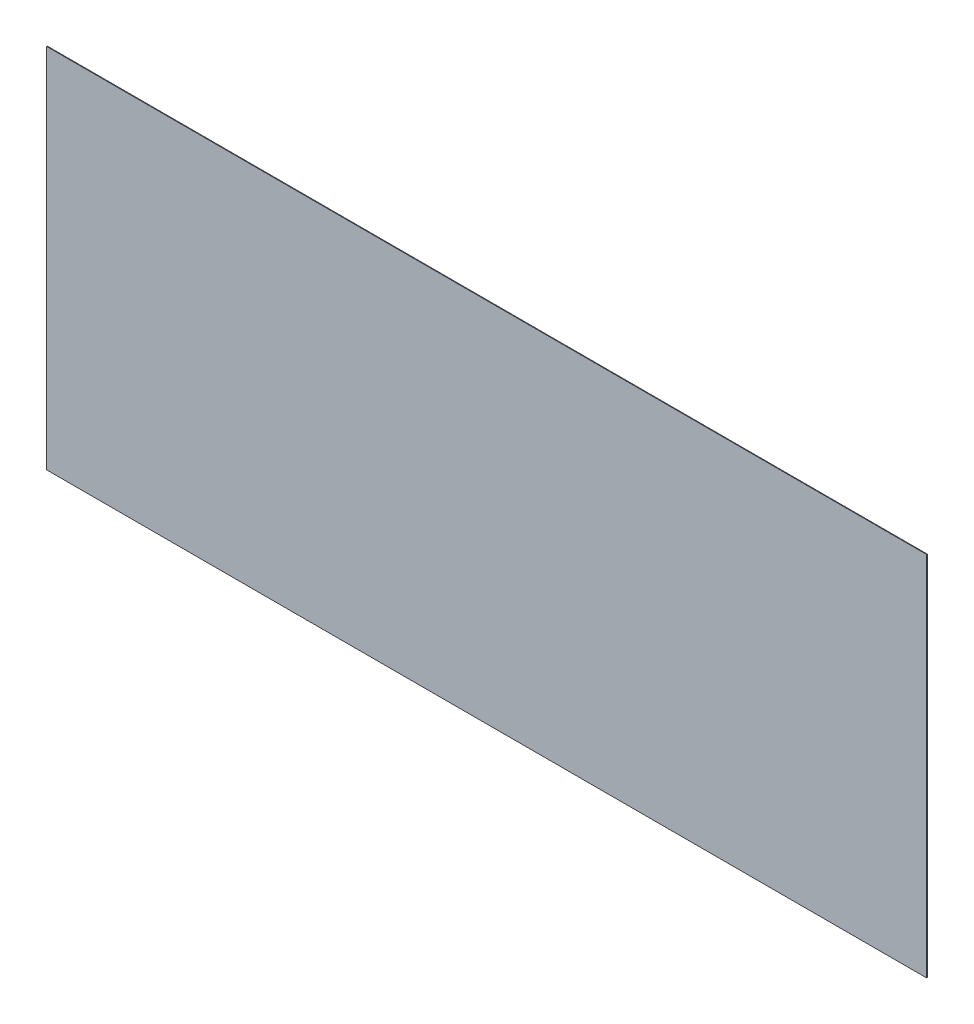
ISO-10303-21;
HEADER;
FILE_DESCRIPTION(('STEP AP214'),'2;1');
FILE_NAME('part.step','',(''),(''),'','','');
FILE_SCHEMA(('AUTOMOTIVE_DESIGN { 1 0 10303 214 1 1 1 1 }'));
ENDSEC;
DATA;
#1=APPLICATION_CONTEXT('core data for automotive mechanical design processes');
#2=APPLICATION_PROTOCOL_DEFINITION('international standard','automotive_design',2000,#1);
#3=PRODUCT_CONTEXT('',#1,'mechanical');
#4=PRODUCT('Part','Part','',(#3));
#5=PRODUCT_RELATED_PRODUCT_CATEGORY('part','',(#4));
#6=PRODUCT_DEFINITION_FORMATION('','',#4);
#7=PRODUCT_DEFINITION_CONTEXT('part definition',#1,'design');
#8=PRODUCT_DEFINITION('design','',#6,#7);
#9=PRODUCT_DEFINITION_SHAPE('','',#8);
#10=(LENGTH_UNIT() NAMED_UNIT(*) SI_UNIT(.MILLI.,.METRE.));
#11=(NAMED_UNIT(*) PLANE_ANGLE_UNIT() SI_UNIT($,.RADIAN.));
#12=(NAMED_UNIT(*) SI_UNIT($,.STERADIAN.) SOLID_ANGLE_UNIT());
#13=UNCERTAINTY_MEASURE_WITH_UNIT(LENGTH_MEASURE(1.E-05),#10,'distance_accuracy_value','');
#14=(GEOMETRIC_REPRESENTATION_CONTEXT(3) GLOBAL_UNCERTAINTY_ASSIGNED_CONTEXT((#13)) GLOBAL_UNIT_ASSIGNED_CONTEXT((#10,
#11,#12)) REPRESENTATION_CONTEXT('',''));
#15=CARTESIAN_POINT('',(0.,0.,0.));
#16=DIRECTION('',(0.,0.,1.));
#17=DIRECTION('',(1.,0.,0.));
#18=AXIS2_PLACEMENT_3D('',#15,#16,#17);
#19=CARTESIAN_POINT('',(-381.51349744069,331.380753138075,0.9));
#20=DIRECTION('',(1.,0.,0.));
#21=DIRECTION('',(0.,1.,0.));
#22=AXIS2_PLACEMENT_3D('',#19,#20,#21);
#23=PLANE('',#22);
#24=DIRECTION('',(0.,-1.,0.));
#25=VECTOR('',#24,1.);
#26=CARTESIAN_POINT('',(-381.51349744069,331.380753138075,0.));
#27=LINE('',#26,#25);
#28=CARTESIAN_POINT('',(-381.51349744069,331.380753138075,0.));
#29=VERTEX_POINT('',#28);
#30=CARTESIAN_POINT('',(-381.51349744069,-168.619246861924,0.));
#31=VERTEX_POINT('',#30);
#32=EDGE_CURVE('E113',#29,#31,#27,.T.);
#33=ORIENTED_EDGE('',*,*,#32,.T.);
#34=DIRECTION('',(0.,0.,-1.));
#35=VECTOR('',#34,1.);
#36=CARTESIAN_POINT('',(-381.51349744069,-168.619246861924,0.9));
#37=LINE('',#36,#35);
#38=CARTESIAN_POINT('',(-381.51349744069,-168.619246861924,0.9));
#39=VERTEX_POINT('',#38);
#40=EDGE_CURVE('E11',#39,#31,#37,.T.);
#41=ORIENTED_EDGE('',*,*,#40,.F.);
#42=DIRECTION('',(0.,-1.,0.));
#43=VECTOR('',#42,1.);
#44=CARTESIAN_POINT('',(-381.51349744069,331.380753138075,0.9));
#45=LINE('',#44,#43);
#46=CARTESIAN_POINT('',(-381.51349744069,331.380753138075,0.9));
#47=VERTEX_POINT('',#46);
#48=EDGE_CURVE('E97',#47,#39,#45,.T.);
#49=ORIENTED_EDGE('',*,*,#48,.F.);
#50=DIRECTION('',(0.,0.,-1.));
#51=VECTOR('',#50,1.);
#52=CARTESIAN_POINT('',(-381.51349744069,331.380753138075,0.9));
#53=LINE('',#52,#51);
#54=EDGE_CURVE('E109',#47,#29,#53,.T.);
#55=ORIENTED_EDGE('',*,*,#54,.T.);
#56=EDGE_LOOP('',(#33,#41,#49,#55));
#57=FACE_BOUND('',#56,.T.);
#58=ADVANCED_FACE('F45',(#57),#23,.F.);
#59=CARTESIAN_POINT('',(-381.51349744069,-168.619246861924,0.9));
#60=DIRECTION('',(0.,1.,0.));
#61=DIRECTION('',(0.,0.,1.));
#62=AXIS2_PLACEMENT_3D('',#59,#60,#61);
#63=PLANE('',#62);
#64=DIRECTION('',(1.,0.,0.));
#65=VECTOR('',#64,1.);
#66=CARTESIAN_POINT('',(-381.51349744069,-168.619246861924,0.));
#67=LINE('',#66,#65);
#68=CARTESIAN_POINT('',(818.48650255931,-168.619246861924,0.));
#69=VERTEX_POINT('',#68);
#70=EDGE_CURVE('E102',#31,#69,#67,.T.);
#71=ORIENTED_EDGE('',*,*,#70,.T.);
#72=DIRECTION('',(0.,0.,-1.));
#73=VECTOR('',#72,1.);
#74=CARTESIAN_POINT('',(818.48650255931,-168.619246861924,0.9));
#75=LINE('',#74,#73);
#76=CARTESIAN_POINT('',(818.48650255931,-168.619246861924,0.9));
#77=VERTEX_POINT('',#76);
#78=EDGE_CURVE('E54',#77,#69,#75,.T.);
#79=ORIENTED_EDGE('',*,*,#78,.F.);
#80=DIRECTION('',(1.,0.,0.));
#81=VECTOR('',#80,1.);
#82=CARTESIAN_POINT('',(-381.51349744069,-168.619246861924,0.9));
#83=LINE('',#82,#81);
#84=EDGE_CURVE('E92',#39,#77,#83,.T.);
#85=ORIENTED_EDGE('',*,*,#84,.F.);
#86=ORIENTED_EDGE('',*,*,#40,.T.);
#87=EDGE_LOOP('',(#71,#79,#85,#86));
#88=FACE_BOUND('',#87,.T.);
#89=ADVANCED_FACE('F101',(#88),#63,.F.);
#90=CARTESIAN_POINT('',(818.48650255931,331.380753138075,0.9));
#91=DIRECTION('',(-1.,0.,0.));
#92=DIRECTION('',(0.,-1.,0.));
#93=AXIS2_PLACEMENT_3D('',#90,#91,#92);
#94=PLANE('',#93);
#95=DIRECTION('',(0.,1.,0.));
#96=VECTOR('',#95,1.);
#97=CARTESIAN_POINT('',(818.48650255931,331.380753138075,0.));
#98=LINE('',#97,#96);
#99=CARTESIAN_POINT('',(818.48650255931,331.380753138075,0.));
#100=VERTEX_POINT('',#99);
#101=EDGE_CURVE('E79',#69,#100,#98,.T.);
#102=ORIENTED_EDGE('',*,*,#101,.T.);
#103=DIRECTION('',(0.,0.,-1.));
#104=VECTOR('',#103,1.);
#105=CARTESIAN_POINT('',(818.48650255931,331.380753138075,0.9));
#106=LINE('',#105,#104);
#107=CARTESIAN_POINT('',(818.48650255931,331.380753138075,0.9));
#108=VERTEX_POINT('',#107);
#109=EDGE_CURVE('E104',#108,#100,#106,.T.);
#110=ORIENTED_EDGE('',*,*,#109,.F.);
#111=DIRECTION('',(0.,1.,0.));
#112=VECTOR('',#111,1.);
#113=CARTESIAN_POINT('',(818.48650255931,331.380753138075,0.9));
#114=LINE('',#113,#112);
#115=EDGE_CURVE('E95',#77,#108,#114,.T.);
#116=ORIENTED_EDGE('',*,*,#115,.F.);
#117=ORIENTED_EDGE('',*,*,#78,.T.);
#118=EDGE_LOOP('',(#102,#110,#116,#117));
#119=FACE_BOUND('',#118,.T.);
#120=ADVANCED_FACE('F105',(#119),#94,.F.);
#121=CARTESIAN_POINT('',(-381.51349744069,331.380753138075,0.9));
#122=DIRECTION('',(0.,-1.,0.));
#123=DIRECTION('',(0.,0.,-1.));
#124=AXIS2_PLACEMENT_3D('',#121,#122,#123);
#125=PLANE('',#124);
#126=DIRECTION('',(-1.,0.,0.));
#127=VECTOR('',#126,1.);
#128=CARTESIAN_POINT('',(-381.51349744069,331.380753138075,0.));
#129=LINE('',#128,#127);
#130=EDGE_CURVE('E85',#100,#29,#129,.T.);
#131=ORIENTED_EDGE('',*,*,#130,.T.);
#132=ORIENTED_EDGE('',*,*,#54,.F.);
#133=DIRECTION('',(-1.,0.,0.));
#134=VECTOR('',#133,1.);
#135=CARTESIAN_POINT('',(-381.51349744069,331.380753138075,0.9));
#136=LINE('',#135,#134);
#137=EDGE_CURVE('E62',#108,#47,#136,.T.);
#138=ORIENTED_EDGE('',*,*,#137,.F.);
#139=ORIENTED_EDGE('',*,*,#109,.T.);
#140=EDGE_LOOP('',(#131,#132,#138,#139));
#141=FACE_BOUND('',#140,.T.);
#142=ADVANCED_FACE('F126',(#141),#125,.F.);
#143=CARTESIAN_POINT('',(0.,0.,0.9));
#144=DIRECTION('',(0.,0.,1.));
#145=DIRECTION('',(1.,0.,0.));
#146=AXIS2_PLACEMENT_3D('',#143,#144,#145);
#147=PLANE('',#146);
#148=ORIENTED_EDGE('',*,*,#48,.T.);
#149=ORIENTED_EDGE('',*,*,#84,.T.);
#150=ORIENTED_EDGE('',*,*,#115,.T.);
#151=ORIENTED_EDGE('',*,*,#137,.T.);
#152=EDGE_LOOP('',(#148,#149,#150,#151));
#153=FACE_BOUND('',#152,.T.);
#154=ADVANCED_FACE('F93',(#153),#147,.T.);
#155=CARTESIAN_POINT('',(0.,0.,0.));
#156=DIRECTION('',(0.,0.,1.));
#157=DIRECTION('',(1.,0.,0.));
#158=AXIS2_PLACEMENT_3D('',#155,#156,#157);
#159=PLANE('',#158);
#160=ORIENTED_EDGE('',*,*,#32,.F.);
#161=ORIENTED_EDGE('',*,*,#130,.F.);
#162=ORIENTED_EDGE('',*,*,#101,.F.);
#163=ORIENTED_EDGE('',*,*,#70,.F.);
#164=EDGE_LOOP('',(#160,#161,#162,#163));
#165=FACE_BOUND('',#164,.T.);
#166=ADVANCED_FACE('F129',(#165),#159,.F.);
#167=CLOSED_SHELL('',(#58,#89,#120,#142,#154,#166));
#168=MANIFOLD_SOLID_BREP('B2',#167);
#169=ADVANCED_BREP_SHAPE_REPRESENTATION('',(#18,#168),#14);
#170=SHAPE_DEFINITION_REPRESENTATION(#9,#169);
ENDSEC;
END-ISO-10303-21;
